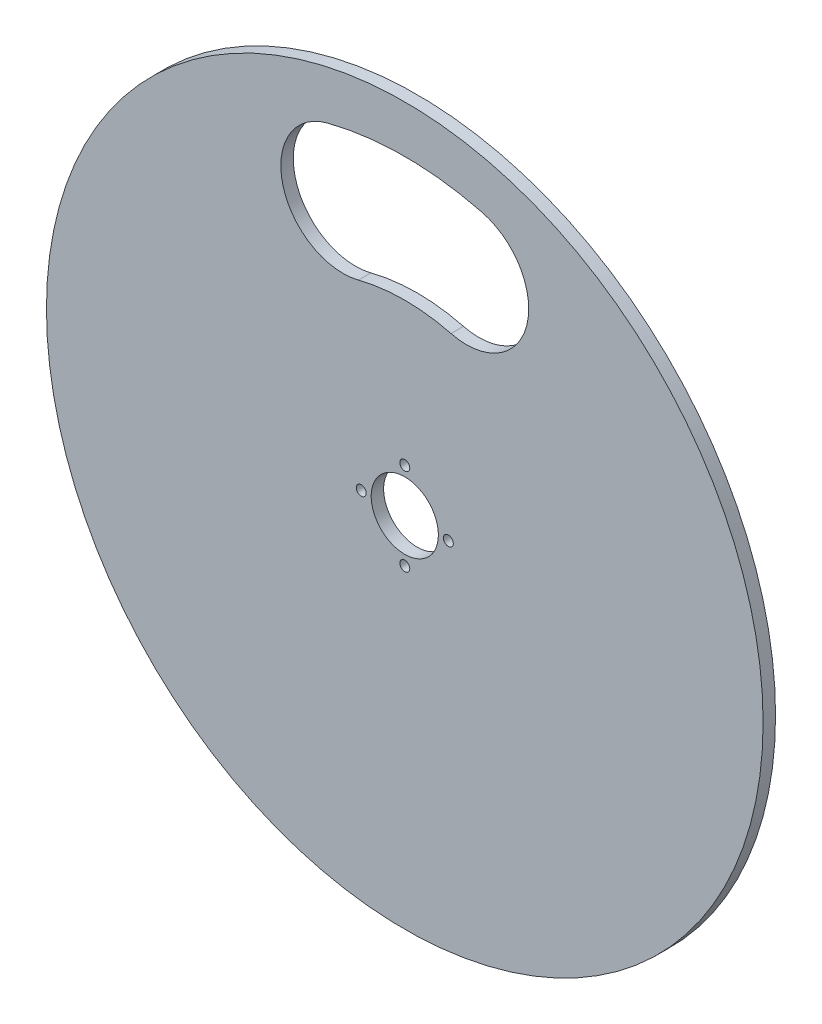
ISO-10303-21;
HEADER;
FILE_DESCRIPTION(('STEP AP214'),'2;1');
FILE_NAME('part.step','',(''),(''),'','','');
FILE_SCHEMA(('AUTOMOTIVE_DESIGN { 1 0 10303 214 1 1 1 1 }'));
ENDSEC;
DATA;
#1=APPLICATION_CONTEXT('core data for automotive mechanical design processes');
#2=APPLICATION_PROTOCOL_DEFINITION('international standard','automotive_design',2000,#1);
#3=PRODUCT_CONTEXT('',#1,'mechanical');
#4=PRODUCT('Part','Part','',(#3));
#5=PRODUCT_RELATED_PRODUCT_CATEGORY('part','',(#4));
#6=PRODUCT_DEFINITION_FORMATION('','',#4);
#7=PRODUCT_DEFINITION_CONTEXT('part definition',#1,'design');
#8=PRODUCT_DEFINITION('design','',#6,#7);
#9=PRODUCT_DEFINITION_SHAPE('','',#8);
#10=(LENGTH_UNIT() NAMED_UNIT(*) SI_UNIT(.MILLI.,.METRE.));
#11=(NAMED_UNIT(*) PLANE_ANGLE_UNIT() SI_UNIT($,.RADIAN.));
#12=(NAMED_UNIT(*) SI_UNIT($,.STERADIAN.) SOLID_ANGLE_UNIT());
#13=UNCERTAINTY_MEASURE_WITH_UNIT(LENGTH_MEASURE(1.E-05),#10,'distance_accuracy_value','');
#14=(GEOMETRIC_REPRESENTATION_CONTEXT(3) GLOBAL_UNCERTAINTY_ASSIGNED_CONTEXT((#13)) GLOBAL_UNIT_ASSIGNED_CONTEXT((#10,
#11,#12)) REPRESENTATION_CONTEXT('',''));
#15=CARTESIAN_POINT('',(0.,0.,0.));
#16=DIRECTION('',(0.,0.,1.));
#17=DIRECTION('',(1.,0.,0.));
#18=AXIS2_PLACEMENT_3D('',#15,#16,#17);
#19=CARTESIAN_POINT('',(0.,0.,5.));
#20=DIRECTION('',(0.,0.,-1.));
#21=DIRECTION('',(-1.,0.,0.));
#22=AXIS2_PLACEMENT_3D('',#19,#20,#21);
#23=CYLINDRICAL_SURFACE('',#22,125.);
#24=CARTESIAN_POINT('',(0.,0.,0.));
#25=DIRECTION('',(0.,0.,1.));
#26=DIRECTION('',(1.,0.,0.));
#27=AXIS2_PLACEMENT_3D('',#24,#25,#26);
#28=CIRCLE('',#27,125.);
#29=CARTESIAN_POINT('',(31.0048981765381,121.09375,0.));
#30=VERTEX_POINT('',#29);
#31=CARTESIAN_POINT('',(-31.0048981765382,121.09375,0.));
#32=VERTEX_POINT('',#31);
#33=EDGE_CURVE('E120',#30,#32,#28,.T.);
#34=ORIENTED_EDGE('',*,*,#33,.F.);
#35=DIRECTION('',(0.,0.,-1.));
#36=VECTOR('',#35,1.);
#37=CARTESIAN_POINT('',(31.0048981765381,121.09375,5.));
#38=LINE('',#37,#36);
#39=CARTESIAN_POINT('',(31.0048981765381,121.09375,5.));
#40=VERTEX_POINT('',#39);
#41=EDGE_CURVE('E11',#40,#30,#38,.T.);
#42=ORIENTED_EDGE('',*,*,#41,.F.);
#43=CARTESIAN_POINT('',(0.,0.,5.));
#44=DIRECTION('',(0.,0.,1.));
#45=DIRECTION('',(1.,0.,0.));
#46=AXIS2_PLACEMENT_3D('',#43,#44,#45);
#47=CIRCLE('',#46,125.);
#48=CARTESIAN_POINT('',(-31.0048981765382,121.09375,5.));
#49=VERTEX_POINT('',#48);
#50=EDGE_CURVE('E96',#40,#49,#47,.T.);
#51=ORIENTED_EDGE('',*,*,#50,.T.);
#52=DIRECTION('',(0.,0.,-1.));
#53=VECTOR('',#52,1.);
#54=CARTESIAN_POINT('',(-31.0048981765382,121.09375,5.));
#55=LINE('',#54,#53);
#56=EDGE_CURVE('E53',#49,#32,#55,.T.);
#57=ORIENTED_EDGE('',*,*,#56,.T.);
#58=EDGE_LOOP('',(#34,#42,#51,#57));
#59=FACE_BOUND('',#58,.T.);
#60=ADVANCED_FACE('F37',(#59),#23,.F.);
#61=CARTESIAN_POINT('',(24.8039185412305,96.875,5.));
#62=DIRECTION('',(0.,0.,-1.));
#63=DIRECTION('',(-1.,0.,0.));
#64=AXIS2_PLACEMENT_3D('',#61,#62,#63);
#65=CYLINDRICAL_SURFACE('',#64,25.);
#66=CARTESIAN_POINT('',(24.8039185412305,96.875,0.));
#67=DIRECTION('',(0.,0.,1.));
#68=DIRECTION('',(1.,0.,0.));
#69=AXIS2_PLACEMENT_3D('',#66,#67,#68);
#70=CIRCLE('',#69,25.);
#71=CARTESIAN_POINT('',(18.6029389059229,72.65625,0.));
#72=VERTEX_POINT('',#71);
#73=EDGE_CURVE('E85',#72,#30,#70,.T.);
#74=ORIENTED_EDGE('',*,*,#73,.F.);
#75=DIRECTION('',(0.,0.,-1.));
#76=VECTOR('',#75,1.);
#77=CARTESIAN_POINT('',(18.6029389059229,72.65625,5.));
#78=LINE('',#77,#76);
#79=CARTESIAN_POINT('',(18.6029389059229,72.65625,5.));
#80=VERTEX_POINT('',#79);
#81=EDGE_CURVE('E45',#80,#72,#78,.T.);
#82=ORIENTED_EDGE('',*,*,#81,.F.);
#83=CARTESIAN_POINT('',(24.8039185412305,96.875,5.));
#84=DIRECTION('',(0.,0.,1.));
#85=DIRECTION('',(1.,0.,0.));
#86=AXIS2_PLACEMENT_3D('',#83,#84,#85);
#87=CIRCLE('',#86,25.);
#88=EDGE_CURVE('E83',#80,#40,#87,.T.);
#89=ORIENTED_EDGE('',*,*,#88,.T.);
#90=ORIENTED_EDGE('',*,*,#41,.T.);
#91=EDGE_LOOP('',(#74,#82,#89,#90));
#92=FACE_BOUND('',#91,.T.);
#93=ADVANCED_FACE('F81',(#92),#65,.F.);
#94=CARTESIAN_POINT('',(0.,0.,5.));
#95=DIRECTION('',(0.,0.,-1.));
#96=DIRECTION('',(-1.,0.,0.));
#97=AXIS2_PLACEMENT_3D('',#94,#95,#96);
#98=CYLINDRICAL_SURFACE('',#97,75.);
#99=CARTESIAN_POINT('',(0.,0.,0.));
#100=DIRECTION('',(0.,0.,1.));
#101=DIRECTION('',(1.,0.,0.));
#102=AXIS2_PLACEMENT_3D('',#99,#100,#101);
#103=CIRCLE('',#102,75.);
#104=CARTESIAN_POINT('',(-18.6029389059229,72.65625,0.));
#105=VERTEX_POINT('',#104);
#106=EDGE_CURVE('E123',#72,#105,#103,.T.);
#107=ORIENTED_EDGE('',*,*,#106,.T.);
#108=DIRECTION('',(0.,0.,-1.));
#109=VECTOR('',#108,1.);
#110=CARTESIAN_POINT('',(-18.6029389059229,72.65625,5.));
#111=LINE('',#110,#109);
#112=CARTESIAN_POINT('',(-18.6029389059229,72.65625,5.));
#113=VERTEX_POINT('',#112);
#114=EDGE_CURVE('E67',#113,#105,#111,.T.);
#115=ORIENTED_EDGE('',*,*,#114,.F.);
#116=CARTESIAN_POINT('',(0.,0.,5.));
#117=DIRECTION('',(0.,0.,1.));
#118=DIRECTION('',(1.,0.,0.));
#119=AXIS2_PLACEMENT_3D('',#116,#117,#118);
#120=CIRCLE('',#119,75.);
#121=EDGE_CURVE('E88',#80,#113,#120,.T.);
#122=ORIENTED_EDGE('',*,*,#121,.F.);
#123=ORIENTED_EDGE('',*,*,#81,.T.);
#124=EDGE_LOOP('',(#107,#115,#122,#123));
#125=FACE_BOUND('',#124,.T.);
#126=ADVANCED_FACE('F89',(#125),#98,.T.);
#127=CARTESIAN_POINT('',(0.,17.5,5.));
#128=DIRECTION('',(0.,0.,-1.));
#129=DIRECTION('',(-1.,0.,0.));
#130=AXIS2_PLACEMENT_3D('',#127,#128,#129);
#131=CYLINDRICAL_SURFACE('',#130,2.);
#132=CARTESIAN_POINT('',(0.,17.5,5.));
#133=DIRECTION('',(0.,0.,1.));
#134=DIRECTION('',(1.,0.,0.));
#135=AXIS2_PLACEMENT_3D('',#132,#133,#134);
#136=CIRCLE('',#135,2.);
#137=CARTESIAN_POINT('',(1.99999999999999,17.5,5.));
#138=VERTEX_POINT('',#137);
#139=EDGE_CURVE('E114',#138,#138,#136,.T.);
#140=ORIENTED_EDGE('',*,*,#139,.T.);
#141=EDGE_LOOP('',(#140));
#142=FACE_BOUND('',#141,.T.);
#143=CARTESIAN_POINT('',(0.,17.5,0.));
#144=DIRECTION('',(0.,0.,1.));
#145=DIRECTION('',(1.,0.,0.));
#146=AXIS2_PLACEMENT_3D('',#143,#144,#145);
#147=CIRCLE('',#146,2.);
#148=CARTESIAN_POINT('',(1.99999999999999,17.5,0.));
#149=VERTEX_POINT('',#148);
#150=EDGE_CURVE('E140',#149,#149,#147,.T.);
#151=ORIENTED_EDGE('',*,*,#150,.F.);
#152=EDGE_LOOP('',(#151));
#153=FACE_BOUND('',#152,.T.);
#154=ADVANCED_FACE('F179',(#142,#153),#131,.F.);
#155=CARTESIAN_POINT('',(-17.5,0.,5.));
#156=DIRECTION('',(0.,0.,-1.));
#157=DIRECTION('',(-1.,0.,0.));
#158=AXIS2_PLACEMENT_3D('',#155,#156,#157);
#159=CYLINDRICAL_SURFACE('',#158,2.);
#160=CARTESIAN_POINT('',(-17.5,0.,5.));
#161=DIRECTION('',(0.,0.,1.));
#162=DIRECTION('',(1.,0.,0.));
#163=AXIS2_PLACEMENT_3D('',#160,#161,#162);
#164=CIRCLE('',#163,2.);
#165=CARTESIAN_POINT('',(-15.5,0.,5.));
#166=VERTEX_POINT('',#165);
#167=EDGE_CURVE('E111',#166,#166,#164,.T.);
#168=ORIENTED_EDGE('',*,*,#167,.T.);
#169=EDGE_LOOP('',(#168));
#170=FACE_BOUND('',#169,.T.);
#171=CARTESIAN_POINT('',(-17.5,0.,0.));
#172=DIRECTION('',(0.,0.,1.));
#173=DIRECTION('',(1.,0.,0.));
#174=AXIS2_PLACEMENT_3D('',#171,#172,#173);
#175=CIRCLE('',#174,2.);
#176=CARTESIAN_POINT('',(-15.5,0.,0.));
#177=VERTEX_POINT('',#176);
#178=EDGE_CURVE('E137',#177,#177,#175,.T.);
#179=ORIENTED_EDGE('',*,*,#178,.F.);
#180=EDGE_LOOP('',(#179));
#181=FACE_BOUND('',#180,.T.);
#182=ADVANCED_FACE('F183',(#170,#181),#159,.F.);
#183=CARTESIAN_POINT('',(0.,-17.5,5.));
#184=DIRECTION('',(0.,0.,-1.));
#185=DIRECTION('',(-1.,0.,0.));
#186=AXIS2_PLACEMENT_3D('',#183,#184,#185);
#187=CYLINDRICAL_SURFACE('',#186,2.);
#188=CARTESIAN_POINT('',(0.,-17.5,5.));
#189=DIRECTION('',(0.,0.,1.));
#190=DIRECTION('',(1.,0.,0.));
#191=AXIS2_PLACEMENT_3D('',#188,#189,#190);
#192=CIRCLE('',#191,2.);
#193=CARTESIAN_POINT('',(2.00000000000001,-17.5,5.));
#194=VERTEX_POINT('',#193);
#195=EDGE_CURVE('E108',#194,#194,#192,.T.);
#196=ORIENTED_EDGE('',*,*,#195,.T.);
#197=EDGE_LOOP('',(#196));
#198=FACE_BOUND('',#197,.T.);
#199=CARTESIAN_POINT('',(0.,-17.5,0.));
#200=DIRECTION('',(0.,0.,1.));
#201=DIRECTION('',(1.,0.,0.));
#202=AXIS2_PLACEMENT_3D('',#199,#200,#201);
#203=CIRCLE('',#202,2.);
#204=CARTESIAN_POINT('',(2.00000000000001,-17.5,0.));
#205=VERTEX_POINT('',#204);
#206=EDGE_CURVE('E134',#205,#205,#203,.T.);
#207=ORIENTED_EDGE('',*,*,#206,.F.);
#208=EDGE_LOOP('',(#207));
#209=FACE_BOUND('',#208,.T.);
#210=ADVANCED_FACE('F189',(#198,#209),#187,.F.);
#211=CARTESIAN_POINT('',(17.5,0.,5.));
#212=DIRECTION('',(0.,0.,-1.));
#213=DIRECTION('',(-1.,0.,0.));
#214=AXIS2_PLACEMENT_3D('',#211,#212,#213);
#215=CYLINDRICAL_SURFACE('',#214,2.);
#216=CARTESIAN_POINT('',(17.5,0.,5.));
#217=DIRECTION('',(0.,0.,1.));
#218=DIRECTION('',(1.,0.,0.));
#219=AXIS2_PLACEMENT_3D('',#216,#217,#218);
#220=CIRCLE('',#219,2.);
#221=CARTESIAN_POINT('',(19.5,0.,5.));
#222=VERTEX_POINT('',#221);
#223=EDGE_CURVE('E105',#222,#222,#220,.T.);
#224=ORIENTED_EDGE('',*,*,#223,.T.);
#225=EDGE_LOOP('',(#224));
#226=FACE_BOUND('',#225,.T.);
#227=CARTESIAN_POINT('',(17.5,0.,0.));
#228=DIRECTION('',(0.,0.,1.));
#229=DIRECTION('',(1.,0.,0.));
#230=AXIS2_PLACEMENT_3D('',#227,#228,#229);
#231=CIRCLE('',#230,2.);
#232=CARTESIAN_POINT('',(19.5,0.,0.));
#233=VERTEX_POINT('',#232);
#234=EDGE_CURVE('E131',#233,#233,#231,.T.);
#235=ORIENTED_EDGE('',*,*,#234,.F.);
#236=EDGE_LOOP('',(#235));
#237=FACE_BOUND('',#236,.T.);
#238=ADVANCED_FACE('F173',(#226,#237),#215,.F.);
#239=CARTESIAN_POINT('',(0.,0.,5.));
#240=DIRECTION('',(0.,0.,-1.));
#241=DIRECTION('',(-1.,0.,0.));
#242=AXIS2_PLACEMENT_3D('',#239,#240,#241);
#243=CYLINDRICAL_SURFACE('',#242,13.5);
#244=CARTESIAN_POINT('',(0.,0.,5.));
#245=DIRECTION('',(0.,0.,1.));
#246=DIRECTION('',(1.,0.,0.));
#247=AXIS2_PLACEMENT_3D('',#244,#245,#246);
#248=CIRCLE('',#247,13.5);
#249=CARTESIAN_POINT('',(13.5,0.,5.));
#250=VERTEX_POINT('',#249);
#251=EDGE_CURVE('E102',#250,#250,#248,.T.);
#252=ORIENTED_EDGE('',*,*,#251,.T.);
#253=EDGE_LOOP('',(#252));
#254=FACE_BOUND('',#253,.T.);
#255=CARTESIAN_POINT('',(0.,0.,0.));
#256=DIRECTION('',(0.,0.,1.));
#257=DIRECTION('',(1.,0.,0.));
#258=AXIS2_PLACEMENT_3D('',#255,#256,#257);
#259=CIRCLE('',#258,13.5);
#260=CARTESIAN_POINT('',(13.5,0.,0.));
#261=VERTEX_POINT('',#260);
#262=EDGE_CURVE('E128',#261,#261,#259,.T.);
#263=ORIENTED_EDGE('',*,*,#262,.F.);
#264=EDGE_LOOP('',(#263));
#265=FACE_BOUND('',#264,.T.);
#266=ADVANCED_FACE('F166',(#254,#265),#243,.F.);
#267=CARTESIAN_POINT('',(-24.8039185412306,96.875,5.));
#268=DIRECTION('',(0.,0.,-1.));
#269=DIRECTION('',(-1.,0.,0.));
#270=AXIS2_PLACEMENT_3D('',#267,#268,#269);
#271=CYLINDRICAL_SURFACE('',#270,25.);
#272=CARTESIAN_POINT('',(-24.8039185412306,96.875,0.));
#273=DIRECTION('',(0.,0.,1.));
#274=DIRECTION('',(1.,0.,0.));
#275=AXIS2_PLACEMENT_3D('',#272,#273,#274);
#276=CIRCLE('',#275,25.);
#277=EDGE_CURVE('E125',#32,#105,#276,.T.);
#278=ORIENTED_EDGE('',*,*,#277,.F.);
#279=ORIENTED_EDGE('',*,*,#56,.F.);
#280=CARTESIAN_POINT('',(-24.8039185412306,96.875,5.));
#281=DIRECTION('',(0.,0.,1.));
#282=DIRECTION('',(1.,0.,0.));
#283=AXIS2_PLACEMENT_3D('',#280,#281,#282);
#284=CIRCLE('',#283,25.);
#285=EDGE_CURVE('E92',#49,#113,#284,.T.);
#286=ORIENTED_EDGE('',*,*,#285,.T.);
#287=ORIENTED_EDGE('',*,*,#114,.T.);
#288=EDGE_LOOP('',(#278,#279,#286,#287));
#289=FACE_BOUND('',#288,.T.);
#290=ADVANCED_FACE('F164',(#289),#271,.F.);
#291=CARTESIAN_POINT('',(0.,0.,5.));
#292=DIRECTION('',(0.,0.,-1.));
#293=DIRECTION('',(-1.,0.,0.));
#294=AXIS2_PLACEMENT_3D('',#291,#292,#293);
#295=CYLINDRICAL_SURFACE('',#294,144.);
#296=CARTESIAN_POINT('',(0.,0.,5.));
#297=DIRECTION('',(0.,0.,1.));
#298=DIRECTION('',(1.,0.,0.));
#299=AXIS2_PLACEMENT_3D('',#296,#297,#298);
#300=CIRCLE('',#299,144.);
#301=CARTESIAN_POINT('',(144.,0.,5.));
#302=VERTEX_POINT('',#301);
#303=EDGE_CURVE('E117',#302,#302,#300,.T.);
#304=ORIENTED_EDGE('',*,*,#303,.F.);
#305=EDGE_LOOP('',(#304));
#306=FACE_BOUND('',#305,.T.);
#307=CARTESIAN_POINT('',(0.,0.,0.));
#308=DIRECTION('',(0.,0.,1.));
#309=DIRECTION('',(1.,0.,0.));
#310=AXIS2_PLACEMENT_3D('',#307,#308,#309);
#311=CIRCLE('',#310,144.);
#312=CARTESIAN_POINT('',(144.,0.,0.));
#313=VERTEX_POINT('',#312);
#314=EDGE_CURVE('E98',#313,#313,#311,.T.);
#315=ORIENTED_EDGE('',*,*,#314,.T.);
#316=EDGE_LOOP('',(#315));
#317=FACE_BOUND('',#316,.T.);
#318=ADVANCED_FACE('F148',(#306,#317),#295,.T.);
#319=CARTESIAN_POINT('',(0.,0.,5.));
#320=DIRECTION('',(0.,0.,1.));
#321=DIRECTION('',(1.,0.,0.));
#322=AXIS2_PLACEMENT_3D('',#319,#320,#321);
#323=PLANE('',#322);
#324=ORIENTED_EDGE('',*,*,#50,.F.);
#325=ORIENTED_EDGE('',*,*,#88,.F.);
#326=ORIENTED_EDGE('',*,*,#121,.T.);
#327=ORIENTED_EDGE('',*,*,#285,.F.);
#328=EDGE_LOOP('',(#324,#325,#326,#327));
#329=FACE_BOUND('',#328,.T.);
#330=ORIENTED_EDGE('',*,*,#251,.F.);
#331=EDGE_LOOP('',(#330));
#332=FACE_BOUND('',#331,.T.);
#333=ORIENTED_EDGE('',*,*,#223,.F.);
#334=EDGE_LOOP('',(#333));
#335=FACE_BOUND('',#334,.T.);
#336=ORIENTED_EDGE('',*,*,#195,.F.);
#337=EDGE_LOOP('',(#336));
#338=FACE_BOUND('',#337,.T.);
#339=ORIENTED_EDGE('',*,*,#167,.F.);
#340=EDGE_LOOP('',(#339));
#341=FACE_BOUND('',#340,.T.);
#342=ORIENTED_EDGE('',*,*,#139,.F.);
#343=EDGE_LOOP('',(#342));
#344=FACE_BOUND('',#343,.T.);
#345=ORIENTED_EDGE('',*,*,#303,.T.);
#346=EDGE_LOOP('',(#345));
#347=FACE_BOUND('',#346,.T.);
#348=ADVANCED_FACE('F94',(#329,#332,#335,#338,#341,#344,#347),#323,.T.);
#349=CARTESIAN_POINT('',(0.,0.,0.));
#350=DIRECTION('',(0.,0.,1.));
#351=DIRECTION('',(1.,0.,0.));
#352=AXIS2_PLACEMENT_3D('',#349,#350,#351);
#353=PLANE('',#352);
#354=ORIENTED_EDGE('',*,*,#33,.T.);
#355=ORIENTED_EDGE('',*,*,#277,.T.);
#356=ORIENTED_EDGE('',*,*,#106,.F.);
#357=ORIENTED_EDGE('',*,*,#73,.T.);
#358=EDGE_LOOP('',(#354,#355,#356,#357));
#359=FACE_BOUND('',#358,.T.);
#360=ORIENTED_EDGE('',*,*,#262,.T.);
#361=EDGE_LOOP('',(#360));
#362=FACE_BOUND('',#361,.T.);
#363=ORIENTED_EDGE('',*,*,#234,.T.);
#364=EDGE_LOOP('',(#363));
#365=FACE_BOUND('',#364,.T.);
#366=ORIENTED_EDGE('',*,*,#206,.T.);
#367=EDGE_LOOP('',(#366));
#368=FACE_BOUND('',#367,.T.);
#369=ORIENTED_EDGE('',*,*,#178,.T.);
#370=EDGE_LOOP('',(#369));
#371=FACE_BOUND('',#370,.T.);
#372=ORIENTED_EDGE('',*,*,#150,.T.);
#373=EDGE_LOOP('',(#372));
#374=FACE_BOUND('',#373,.T.);
#375=ORIENTED_EDGE('',*,*,#314,.F.);
#376=EDGE_LOOP('',(#375));
#377=FACE_BOUND('',#376,.T.);
#378=ADVANCED_FACE('F150',(#359,#362,#365,#368,#371,#374,#377),#353,.F.);
#379=CLOSED_SHELL('',(#60,#93,#126,#154,#182,#210,#238,#266,#290,#318,#348,#378));
#380=MANIFOLD_SOLID_BREP('B2',#379);
#381=ADVANCED_BREP_SHAPE_REPRESENTATION('',(#18,#380),#14);
#382=SHAPE_DEFINITION_REPRESENTATION(#9,#381);
ENDSEC;
END-ISO-10303-21;
